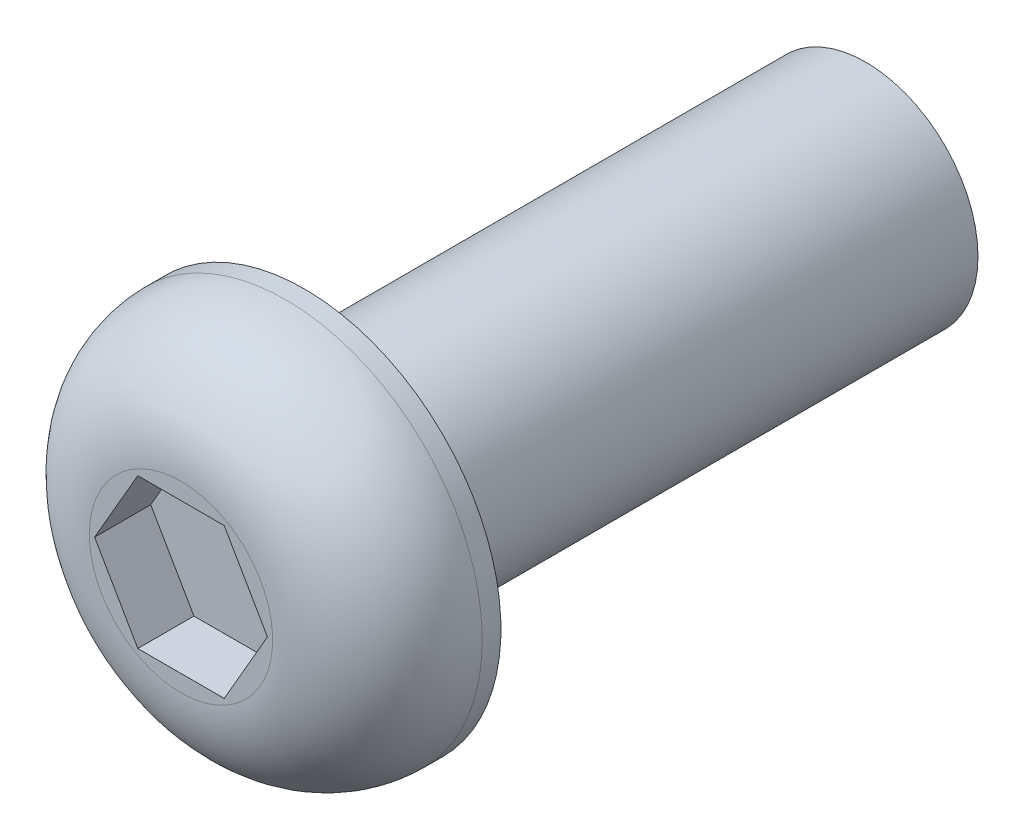
ISO-10303-21;
HEADER;
FILE_DESCRIPTION(('STEP AP214'),'2;1');
FILE_NAME('part.step','',(''),(''),'','','');
FILE_SCHEMA(('AUTOMOTIVE_DESIGN { 1 0 10303 214 1 1 1 1 }'));
ENDSEC;
DATA;
#1=APPLICATION_CONTEXT('core data for automotive mechanical design processes');
#2=APPLICATION_PROTOCOL_DEFINITION('international standard','automotive_design',2000,#1);
#3=PRODUCT_CONTEXT('',#1,'mechanical');
#4=PRODUCT('Part','Part','',(#3));
#5=PRODUCT_RELATED_PRODUCT_CATEGORY('part','',(#4));
#6=PRODUCT_DEFINITION_FORMATION('','',#4);
#7=PRODUCT_DEFINITION_CONTEXT('part definition',#1,'design');
#8=PRODUCT_DEFINITION('design','',#6,#7);
#9=PRODUCT_DEFINITION_SHAPE('','',#8);
#10=(LENGTH_UNIT() NAMED_UNIT(*) SI_UNIT(.MILLI.,.METRE.));
#11=(NAMED_UNIT(*) PLANE_ANGLE_UNIT() SI_UNIT($,.RADIAN.));
#12=(NAMED_UNIT(*) SI_UNIT($,.STERADIAN.) SOLID_ANGLE_UNIT());
#13=UNCERTAINTY_MEASURE_WITH_UNIT(LENGTH_MEASURE(1.E-05),#10,'distance_accuracy_value','');
#14=(GEOMETRIC_REPRESENTATION_CONTEXT(3) GLOBAL_UNCERTAINTY_ASSIGNED_CONTEXT((#13)) GLOBAL_UNIT_ASSIGNED_CONTEXT((#10,
#11,#12)) REPRESENTATION_CONTEXT('',''));
#15=CARTESIAN_POINT('',(0.,0.,0.));
#16=DIRECTION('',(0.,0.,1.));
#17=DIRECTION('',(1.,0.,0.));
#18=AXIS2_PLACEMENT_3D('',#15,#16,#17);
#19=CARTESIAN_POINT('',(0.,0.,-30.));
#20=DIRECTION('',(0.,0.,1.));
#21=DIRECTION('',(1.,0.,0.));
#22=AXIS2_PLACEMENT_3D('',#19,#20,#21);
#23=CYLINDRICAL_SURFACE('',#22,6.);
#24=CARTESIAN_POINT('',(0.,0.,-30.));
#25=DIRECTION('',(0.,0.,1.));
#26=DIRECTION('',(1.,0.,0.));
#27=AXIS2_PLACEMENT_3D('',#24,#25,#26);
#28=CIRCLE('',#27,6.);
#29=CARTESIAN_POINT('',(6.,0.,-30.));
#30=VERTEX_POINT('',#29);
#31=EDGE_CURVE('E11',#30,#30,#28,.T.);
#32=ORIENTED_EDGE('',*,*,#31,.T.);
#33=EDGE_LOOP('',(#32));
#34=FACE_BOUND('',#33,.T.);
#35=CARTESIAN_POINT('',(0.,0.,0.));
#36=DIRECTION('',(0.,0.,1.));
#37=DIRECTION('',(1.,0.,0.));
#38=AXIS2_PLACEMENT_3D('',#35,#36,#37);
#39=CIRCLE('',#38,6.);
#40=CARTESIAN_POINT('',(6.,0.,0.));
#41=VERTEX_POINT('',#40);
#42=EDGE_CURVE('E36',#41,#41,#39,.T.);
#43=ORIENTED_EDGE('',*,*,#42,.F.);
#44=EDGE_LOOP('',(#43));
#45=FACE_BOUND('',#44,.T.);
#46=ADVANCED_FACE('F33',(#34,#45),#23,.T.);
#47=CARTESIAN_POINT('',(0.,0.,-30.));
#48=DIRECTION('',(0.,0.,1.));
#49=DIRECTION('',(1.,0.,0.));
#50=AXIS2_PLACEMENT_3D('',#47,#48,#49);
#51=PLANE('',#50);
#52=ORIENTED_EDGE('',*,*,#31,.F.);
#53=EDGE_LOOP('',(#52));
#54=FACE_BOUND('',#53,.T.);
#55=ADVANCED_FACE('F156',(#54),#51,.F.);
#56=CARTESIAN_POINT('',(0.,0.,6.6));
#57=DIRECTION('',(0.,0.,1.));
#58=DIRECTION('',(1.,0.,0.));
#59=AXIS2_PLACEMENT_3D('',#56,#57,#58);
#60=PLANE('',#59);
#61=DIRECTION('',(-1.,0.,0.));
#62=VECTOR('',#61,1.);
#63=CARTESIAN_POINT('',(2.3094010767585,4.,6.6));
#64=LINE('',#63,#62);
#65=CARTESIAN_POINT('',(2.3094010767585,4.,6.6));
#66=VERTEX_POINT('',#65);
#67=CARTESIAN_POINT('',(-2.3094010767585,4.,6.6));
#68=VERTEX_POINT('',#67);
#69=EDGE_CURVE('E47',#66,#68,#64,.T.);
#70=ORIENTED_EDGE('',*,*,#69,.F.);
#71=DIRECTION('',(-0.5,0.866025403784439,0.));
#72=VECTOR('',#71,1.);
#73=CARTESIAN_POINT('',(4.61880215351701,0.,6.6));
#74=LINE('',#73,#72);
#75=CARTESIAN_POINT('',(4.61880215351701,0.,6.6));
#76=VERTEX_POINT('',#75);
#77=EDGE_CURVE('E130',#76,#66,#74,.T.);
#78=ORIENTED_EDGE('',*,*,#77,.F.);
#79=DIRECTION('',(0.5,0.866025403784439,0.));
#80=VECTOR('',#79,1.);
#81=CARTESIAN_POINT('',(2.3094010767585,-4.,6.6));
#82=LINE('',#81,#80);
#83=CARTESIAN_POINT('',(2.3094010767585,-4.,6.6));
#84=VERTEX_POINT('',#83);
#85=EDGE_CURVE('E128',#84,#76,#82,.T.);
#86=ORIENTED_EDGE('',*,*,#85,.F.);
#87=DIRECTION('',(1.,0.,0.));
#88=VECTOR('',#87,1.);
#89=CARTESIAN_POINT('',(-2.3094010767585,-4.,6.6));
#90=LINE('',#89,#88);
#91=CARTESIAN_POINT('',(-2.3094010767585,-4.,6.6));
#92=VERTEX_POINT('',#91);
#93=EDGE_CURVE('E95',#92,#84,#90,.T.);
#94=ORIENTED_EDGE('',*,*,#93,.F.);
#95=DIRECTION('',(0.5,-0.866025403784439,0.));
#96=VECTOR('',#95,1.);
#97=CARTESIAN_POINT('',(-4.61880215351701,0.,6.6));
#98=LINE('',#97,#96);
#99=CARTESIAN_POINT('',(-4.61880215351701,0.,6.6));
#100=VERTEX_POINT('',#99);
#101=EDGE_CURVE('E124',#100,#92,#98,.T.);
#102=ORIENTED_EDGE('',*,*,#101,.F.);
#103=DIRECTION('',(-0.5,-0.866025403784438,0.));
#104=VECTOR('',#103,1.);
#105=CARTESIAN_POINT('',(-2.3094010767585,4.,6.6));
#106=LINE('',#105,#104);
#107=EDGE_CURVE('E121',#68,#100,#106,.T.);
#108=ORIENTED_EDGE('',*,*,#107,.F.);
#109=EDGE_LOOP('',(#70,#78,#86,#94,#102,#108));
#110=FACE_BOUND('',#109,.T.);
#111=CARTESIAN_POINT('',(0.,0.,6.6));
#112=DIRECTION('',(0.,0.,-1.));
#113=DIRECTION('',(-1.,0.,0.));
#114=AXIS2_PLACEMENT_3D('',#111,#112,#113);
#115=CIRCLE('',#114,4.9);
#116=CARTESIAN_POINT('',(-4.9,0.,6.6));
#117=VERTEX_POINT('',#116);
#118=EDGE_CURVE('E145',#117,#117,#115,.T.);
#119=ORIENTED_EDGE('',*,*,#118,.F.);
#120=EDGE_LOOP('',(#119));
#121=FACE_BOUND('',#120,.T.);
#122=ADVANCED_FACE('F161',(#110,#121),#60,.T.);
#123=CARTESIAN_POINT('',(0.,0.,0.999999999999999));
#124=DIRECTION('',(0.,0.,-1.));
#125=DIRECTION('',(-1.,0.,0.));
#126=AXIS2_PLACEMENT_3D('',#123,#124,#125);
#127=DEGENERATE_TOROIDAL_SURFACE('',#126,4.9,5.6,.T.);
#128=ORIENTED_EDGE('',*,*,#118,.T.);
#129=EDGE_LOOP('',(#128));
#130=FACE_BOUND('',#129,.T.);
#131=CARTESIAN_POINT('',(0.,0.,1.));
#132=DIRECTION('',(0.,0.,-1.));
#133=DIRECTION('',(-1.,0.,0.));
#134=AXIS2_PLACEMENT_3D('',#131,#132,#133);
#135=CIRCLE('',#134,10.5);
#136=CARTESIAN_POINT('',(-10.5,0.,1.));
#137=VERTEX_POINT('',#136);
#138=EDGE_CURVE('E142',#137,#137,#135,.T.);
#139=ORIENTED_EDGE('',*,*,#138,.F.);
#140=EDGE_LOOP('',(#139));
#141=FACE_BOUND('',#140,.T.);
#142=ADVANCED_FACE('F167',(#130,#141),#127,.T.);
#143=CARTESIAN_POINT('',(0.,0.,0.));
#144=DIRECTION('',(0.,0.,-1.));
#145=DIRECTION('',(-1.,0.,0.));
#146=AXIS2_PLACEMENT_3D('',#143,#144,#145);
#147=CYLINDRICAL_SURFACE('',#146,10.5);
#148=ORIENTED_EDGE('',*,*,#138,.T.);
#149=EDGE_LOOP('',(#148));
#150=FACE_BOUND('',#149,.T.);
#151=CARTESIAN_POINT('',(0.,0.,0.));
#152=DIRECTION('',(0.,0.,-1.));
#153=DIRECTION('',(-1.,0.,0.));
#154=AXIS2_PLACEMENT_3D('',#151,#152,#153);
#155=CIRCLE('',#154,10.5);
#156=CARTESIAN_POINT('',(-10.5,0.,0.));
#157=VERTEX_POINT('',#156);
#158=EDGE_CURVE('E134',#157,#157,#155,.T.);
#159=ORIENTED_EDGE('',*,*,#158,.F.);
#160=EDGE_LOOP('',(#159));
#161=FACE_BOUND('',#160,.T.);
#162=ADVANCED_FACE('F173',(#150,#161),#147,.T.);
#163=CARTESIAN_POINT('',(0.,0.,0.));
#164=DIRECTION('',(0.,0.,-1.));
#165=DIRECTION('',(-1.,0.,0.));
#166=AXIS2_PLACEMENT_3D('',#163,#164,#165);
#167=PLANE('',#166);
#168=ORIENTED_EDGE('',*,*,#42,.T.);
#169=EDGE_LOOP('',(#168));
#170=FACE_BOUND('',#169,.T.);
#171=ORIENTED_EDGE('',*,*,#158,.T.);
#172=EDGE_LOOP('',(#171));
#173=FACE_BOUND('',#172,.T.);
#174=ADVANCED_FACE('F152',(#170,#173),#167,.T.);
#175=CARTESIAN_POINT('',(2.3094010767585,4.,3.6));
#176=DIRECTION('',(0.,1.,0.));
#177=DIRECTION('',(0.,0.,1.));
#178=AXIS2_PLACEMENT_3D('',#175,#176,#177);
#179=PLANE('',#178);
#180=ORIENTED_EDGE('',*,*,#69,.T.);
#181=DIRECTION('',(0.,0.,1.));
#182=VECTOR('',#181,1.);
#183=CARTESIAN_POINT('',(-2.3094010767585,4.,3.6));
#184=LINE('',#183,#182);
#185=CARTESIAN_POINT('',(-2.3094010767585,4.,3.6));
#186=VERTEX_POINT('',#185);
#187=EDGE_CURVE('E77',#186,#68,#184,.T.);
#188=ORIENTED_EDGE('',*,*,#187,.F.);
#189=DIRECTION('',(-1.,0.,0.));
#190=VECTOR('',#189,1.);
#191=CARTESIAN_POINT('',(2.3094010767585,4.,3.6));
#192=LINE('',#191,#190);
#193=CARTESIAN_POINT('',(2.3094010767585,4.,3.6));
#194=VERTEX_POINT('',#193);
#195=EDGE_CURVE('E132',#194,#186,#192,.T.);
#196=ORIENTED_EDGE('',*,*,#195,.F.);
#197=DIRECTION('',(0.,0.,1.));
#198=VECTOR('',#197,1.);
#199=CARTESIAN_POINT('',(2.3094010767585,4.,3.6));
#200=LINE('',#199,#198);
#201=EDGE_CURVE('E55',#194,#66,#200,.T.);
#202=ORIENTED_EDGE('',*,*,#201,.T.);
#203=EDGE_LOOP('',(#180,#188,#196,#202));
#204=FACE_BOUND('',#203,.T.);
#205=ADVANCED_FACE('F179',(#204),#179,.F.);
#206=CARTESIAN_POINT('',(4.61880215351701,0.,3.6));
#207=DIRECTION('',(0.866025403784439,0.5,0.));
#208=DIRECTION('',(-0.5,0.866025403784439,0.));
#209=AXIS2_PLACEMENT_3D('',#206,#207,#208);
#210=PLANE('',#209);
#211=ORIENTED_EDGE('',*,*,#77,.T.);
#212=ORIENTED_EDGE('',*,*,#201,.F.);
#213=DIRECTION('',(-0.5,0.866025403784439,0.));
#214=VECTOR('',#213,1.);
#215=CARTESIAN_POINT('',(4.61880215351701,0.,3.6));
#216=LINE('',#215,#214);
#217=CARTESIAN_POINT('',(4.61880215351701,0.,3.6));
#218=VERTEX_POINT('',#217);
#219=EDGE_CURVE('E107',#218,#194,#216,.T.);
#220=ORIENTED_EDGE('',*,*,#219,.F.);
#221=DIRECTION('',(0.,0.,1.));
#222=VECTOR('',#221,1.);
#223=CARTESIAN_POINT('',(4.61880215351701,0.,3.6));
#224=LINE('',#223,#222);
#225=EDGE_CURVE('E99',#218,#76,#224,.T.);
#226=ORIENTED_EDGE('',*,*,#225,.T.);
#227=EDGE_LOOP('',(#211,#212,#220,#226));
#228=FACE_BOUND('',#227,.T.);
#229=ADVANCED_FACE('F182',(#228),#210,.F.);
#230=CARTESIAN_POINT('',(2.3094010767585,-4.,3.6));
#231=DIRECTION('',(0.866025403784439,-0.5,0.));
#232=DIRECTION('',(0.5,0.866025403784439,0.));
#233=AXIS2_PLACEMENT_3D('',#230,#231,#232);
#234=PLANE('',#233);
#235=ORIENTED_EDGE('',*,*,#85,.T.);
#236=ORIENTED_EDGE('',*,*,#225,.F.);
#237=DIRECTION('',(0.5,0.866025403784439,0.));
#238=VECTOR('',#237,1.);
#239=CARTESIAN_POINT('',(2.3094010767585,-4.,3.6));
#240=LINE('',#239,#238);
#241=CARTESIAN_POINT('',(2.3094010767585,-4.,3.6));
#242=VERTEX_POINT('',#241);
#243=EDGE_CURVE('E103',#242,#218,#240,.T.);
#244=ORIENTED_EDGE('',*,*,#243,.F.);
#245=DIRECTION('',(0.,0.,1.));
#246=VECTOR('',#245,1.);
#247=CARTESIAN_POINT('',(2.3094010767585,-4.,3.6));
#248=LINE('',#247,#246);
#249=EDGE_CURVE('E88',#242,#84,#248,.T.);
#250=ORIENTED_EDGE('',*,*,#249,.T.);
#251=EDGE_LOOP('',(#235,#236,#244,#250));
#252=FACE_BOUND('',#251,.T.);
#253=ADVANCED_FACE('F104',(#252),#234,.F.);
#254=CARTESIAN_POINT('',(-2.3094010767585,-4.,3.6));
#255=DIRECTION('',(0.,-1.,0.));
#256=DIRECTION('',(0.,0.,-1.));
#257=AXIS2_PLACEMENT_3D('',#254,#255,#256);
#258=PLANE('',#257);
#259=ORIENTED_EDGE('',*,*,#93,.T.);
#260=ORIENTED_EDGE('',*,*,#249,.F.);
#261=DIRECTION('',(1.,0.,0.));
#262=VECTOR('',#261,1.);
#263=CARTESIAN_POINT('',(-2.3094010767585,-4.,3.6));
#264=LINE('',#263,#262);
#265=CARTESIAN_POINT('',(-2.3094010767585,-4.,3.6));
#266=VERTEX_POINT('',#265);
#267=EDGE_CURVE('E92',#266,#242,#264,.T.);
#268=ORIENTED_EDGE('',*,*,#267,.F.);
#269=DIRECTION('',(0.,0.,1.));
#270=VECTOR('',#269,1.);
#271=CARTESIAN_POINT('',(-2.3094010767585,-4.,3.6));
#272=LINE('',#271,#270);
#273=EDGE_CURVE('E100',#266,#92,#272,.T.);
#274=ORIENTED_EDGE('',*,*,#273,.T.);
#275=EDGE_LOOP('',(#259,#260,#268,#274));
#276=FACE_BOUND('',#275,.T.);
#277=ADVANCED_FACE('F90',(#276),#258,.F.);
#278=CARTESIAN_POINT('',(-4.61880215351701,0.,3.6));
#279=DIRECTION('',(-0.866025403784439,-0.5,0.));
#280=DIRECTION('',(0.5,-0.866025403784439,0.));
#281=AXIS2_PLACEMENT_3D('',#278,#279,#280);
#282=PLANE('',#281);
#283=ORIENTED_EDGE('',*,*,#101,.T.);
#284=ORIENTED_EDGE('',*,*,#273,.F.);
#285=DIRECTION('',(0.5,-0.866025403784439,0.));
#286=VECTOR('',#285,1.);
#287=CARTESIAN_POINT('',(-4.61880215351701,0.,3.6));
#288=LINE('',#287,#286);
#289=CARTESIAN_POINT('',(-4.61880215351701,0.,3.6));
#290=VERTEX_POINT('',#289);
#291=EDGE_CURVE('E113',#290,#266,#288,.T.);
#292=ORIENTED_EDGE('',*,*,#291,.F.);
#293=DIRECTION('',(0.,0.,1.));
#294=VECTOR('',#293,1.);
#295=CARTESIAN_POINT('',(-4.61880215351701,0.,3.6));
#296=LINE('',#295,#294);
#297=EDGE_CURVE('E137',#290,#100,#296,.T.);
#298=ORIENTED_EDGE('',*,*,#297,.T.);
#299=EDGE_LOOP('',(#283,#284,#292,#298));
#300=FACE_BOUND('',#299,.T.);
#301=ADVANCED_FACE('F186',(#300),#282,.F.);
#302=CARTESIAN_POINT('',(-2.3094010767585,4.,3.6));
#303=DIRECTION('',(-0.866025403784439,0.5,0.));
#304=DIRECTION('',(-0.5,-0.866025403784439,0.));
#305=AXIS2_PLACEMENT_3D('',#302,#303,#304);
#306=PLANE('',#305);
#307=ORIENTED_EDGE('',*,*,#107,.T.);
#308=ORIENTED_EDGE('',*,*,#297,.F.);
#309=DIRECTION('',(-0.5,-0.866025403784438,0.));
#310=VECTOR('',#309,1.);
#311=CARTESIAN_POINT('',(-2.3094010767585,4.,3.6));
#312=LINE('',#311,#310);
#313=EDGE_CURVE('E115',#186,#290,#312,.T.);
#314=ORIENTED_EDGE('',*,*,#313,.F.);
#315=ORIENTED_EDGE('',*,*,#187,.T.);
#316=EDGE_LOOP('',(#307,#308,#314,#315));
#317=FACE_BOUND('',#316,.T.);
#318=ADVANCED_FACE('F183',(#317),#306,.F.);
#319=CARTESIAN_POINT('',(-6.92820323027551,4.,3.6));
#320=DIRECTION('',(0.,0.,1.));
#321=DIRECTION('',(1.,0.,0.));
#322=AXIS2_PLACEMENT_3D('',#319,#320,#321);
#323=PLANE('',#322);
#324=ORIENTED_EDGE('',*,*,#195,.T.);
#325=ORIENTED_EDGE('',*,*,#313,.T.);
#326=ORIENTED_EDGE('',*,*,#291,.T.);
#327=ORIENTED_EDGE('',*,*,#267,.T.);
#328=ORIENTED_EDGE('',*,*,#243,.T.);
#329=ORIENTED_EDGE('',*,*,#219,.T.);
#330=EDGE_LOOP('',(#324,#325,#326,#327,#328,#329));
#331=FACE_BOUND('',#330,.T.);
#332=ADVANCED_FACE('F110',(#331),#323,.T.);
#333=CLOSED_SHELL('',(#46,#55,#122,#142,#162,#174,#205,#229,#253,#277,#301,#318,#332));
#334=MANIFOLD_SOLID_BREP('B2',#333);
#335=ADVANCED_BREP_SHAPE_REPRESENTATION('',(#18,#334),#14);
#336=SHAPE_DEFINITION_REPRESENTATION(#9,#335);
ENDSEC;
END-ISO-10303-21;
